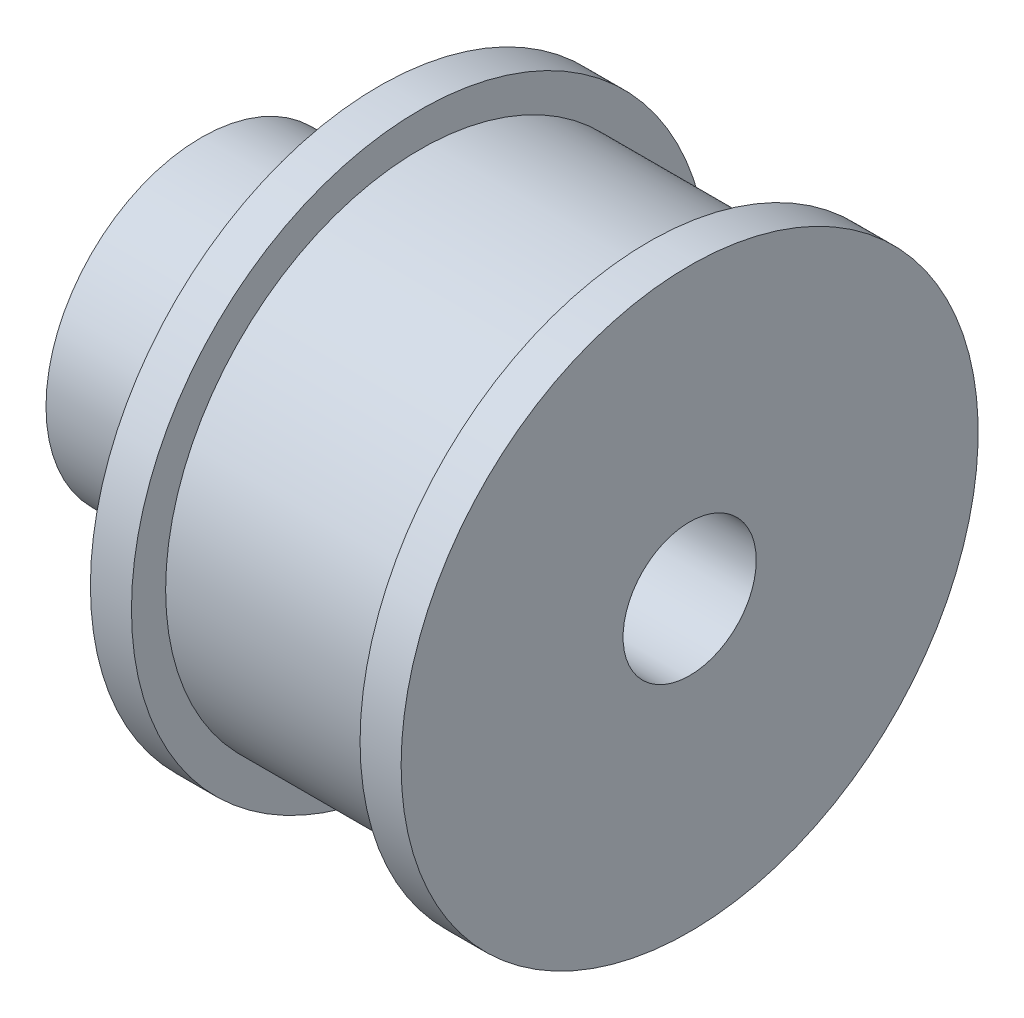
ISO-10303-21;
HEADER;
FILE_DESCRIPTION(('STEP AP214'),'2;1');
FILE_NAME('part.step','',(''),(''),'','','');
FILE_SCHEMA(('AUTOMOTIVE_DESIGN { 1 0 10303 214 1 1 1 1 }'));
ENDSEC;
DATA;
#1=APPLICATION_CONTEXT('core data for automotive mechanical design processes');
#2=APPLICATION_PROTOCOL_DEFINITION('international standard','automotive_design',2000,#1);
#3=PRODUCT_CONTEXT('',#1,'mechanical');
#4=PRODUCT('Part','Part','',(#3));
#5=PRODUCT_RELATED_PRODUCT_CATEGORY('part','',(#4));
#6=PRODUCT_DEFINITION_FORMATION('','',#4);
#7=PRODUCT_DEFINITION_CONTEXT('part definition',#1,'design');
#8=PRODUCT_DEFINITION('design','',#6,#7);
#9=PRODUCT_DEFINITION_SHAPE('','',#8);
#10=(LENGTH_UNIT() NAMED_UNIT(*) SI_UNIT(.MILLI.,.METRE.));
#11=(NAMED_UNIT(*) PLANE_ANGLE_UNIT() SI_UNIT($,.RADIAN.));
#12=(NAMED_UNIT(*) SI_UNIT($,.STERADIAN.) SOLID_ANGLE_UNIT());
#13=UNCERTAINTY_MEASURE_WITH_UNIT(LENGTH_MEASURE(1.E-05),#10,'distance_accuracy_value','');
#14=(GEOMETRIC_REPRESENTATION_CONTEXT(3) GLOBAL_UNCERTAINTY_ASSIGNED_CONTEXT((#13)) GLOBAL_UNIT_ASSIGNED_CONTEXT((#10,
#11,#12)) REPRESENTATION_CONTEXT('',''));
#15=CARTESIAN_POINT('',(0.,0.,0.));
#16=DIRECTION('',(0.,0.,1.));
#17=DIRECTION('',(1.,0.,0.));
#18=AXIS2_PLACEMENT_3D('',#15,#16,#17);
#19=CARTESIAN_POINT('',(-5.15,0.,11.46));
#20=DIRECTION('',(1.,0.,0.));
#21=DIRECTION('',(0.,0.,-1.));
#22=AXIS2_PLACEMENT_3D('',#19,#20,#21);
#23=PLANE('',#22);
#24=CARTESIAN_POINT('',(-5.15,0.,0.));
#25=DIRECTION('',(-1.,0.,0.));
#26=DIRECTION('',(0.,0.,1.));
#27=AXIS2_PLACEMENT_3D('',#24,#25,#26);
#28=CIRCLE('',#27,11.46);
#29=CARTESIAN_POINT('',(-5.15,0.,11.46));
#30=VERTEX_POINT('',#29);
#31=EDGE_CURVE('E58',#30,#30,#28,.T.);
#32=ORIENTED_EDGE('',*,*,#31,.T.);
#33=EDGE_LOOP('',(#32));
#34=FACE_BOUND('',#33,.T.);
#35=CARTESIAN_POINT('',(-5.15,0.,0.));
#36=DIRECTION('',(-1.,0.,0.));
#37=DIRECTION('',(0.,0.,1.));
#38=AXIS2_PLACEMENT_3D('',#35,#36,#37);
#39=CIRCLE('',#38,13.);
#40=CARTESIAN_POINT('',(-5.15,0.,13.));
#41=VERTEX_POINT('',#40);
#42=EDGE_CURVE('E10',#41,#41,#39,.T.);
#43=ORIENTED_EDGE('',*,*,#42,.F.);
#44=EDGE_LOOP('',(#43));
#45=FACE_BOUND('',#44,.T.);
#46=ADVANCED_FACE('F30',(#34,#45),#23,.T.);
#47=CARTESIAN_POINT('',(-7.,0.,0.));
#48=DIRECTION('',(-1.,0.,0.));
#49=DIRECTION('',(0.,0.,1.));
#50=AXIS2_PLACEMENT_3D('',#47,#48,#49);
#51=CYLINDRICAL_SURFACE('',#50,13.);
#52=ORIENTED_EDGE('',*,*,#42,.T.);
#53=EDGE_LOOP('',(#52));
#54=FACE_BOUND('',#53,.T.);
#55=CARTESIAN_POINT('',(-7.,0.,0.));
#56=DIRECTION('',(-1.,0.,0.));
#57=DIRECTION('',(0.,0.,1.));
#58=AXIS2_PLACEMENT_3D('',#55,#56,#57);
#59=CIRCLE('',#58,13.);
#60=CARTESIAN_POINT('',(-7.,0.,13.));
#61=VERTEX_POINT('',#60);
#62=EDGE_CURVE('E36',#61,#61,#59,.T.);
#63=ORIENTED_EDGE('',*,*,#62,.F.);
#64=EDGE_LOOP('',(#63));
#65=FACE_BOUND('',#64,.T.);
#66=ADVANCED_FACE('F97',(#54,#65),#51,.T.);
#67=CARTESIAN_POINT('',(-7.,0.,13.));
#68=DIRECTION('',(-1.,0.,0.));
#69=DIRECTION('',(0.,0.,1.));
#70=AXIS2_PLACEMENT_3D('',#67,#68,#69);
#71=PLANE('',#70);
#72=ORIENTED_EDGE('',*,*,#62,.T.);
#73=EDGE_LOOP('',(#72));
#74=FACE_BOUND('',#73,.T.);
#75=CARTESIAN_POINT('',(-7.,0.,0.));
#76=DIRECTION('',(-1.,0.,0.));
#77=DIRECTION('',(0.,0.,1.));
#78=AXIS2_PLACEMENT_3D('',#75,#76,#77);
#79=CIRCLE('',#78,7.);
#80=CARTESIAN_POINT('',(-7.,0.,7.));
#81=VERTEX_POINT('',#80);
#82=EDGE_CURVE('E40',#81,#81,#79,.T.);
#83=ORIENTED_EDGE('',*,*,#82,.F.);
#84=EDGE_LOOP('',(#83));
#85=FACE_BOUND('',#84,.T.);
#86=ADVANCED_FACE('F101',(#74,#85),#71,.T.);
#87=CARTESIAN_POINT('',(-7.,0.,0.));
#88=DIRECTION('',(-1.,0.,0.));
#89=DIRECTION('',(0.,0.,1.));
#90=AXIS2_PLACEMENT_3D('',#87,#88,#89);
#91=CYLINDRICAL_SURFACE('',#90,7.);
#92=ORIENTED_EDGE('',*,*,#82,.T.);
#93=EDGE_LOOP('',(#92));
#94=FACE_BOUND('',#93,.T.);
#95=CARTESIAN_POINT('',(-15.,0.,0.));
#96=DIRECTION('',(-1.,0.,0.));
#97=DIRECTION('',(0.,0.,1.));
#98=AXIS2_PLACEMENT_3D('',#95,#96,#97);
#99=CIRCLE('',#98,7.);
#100=CARTESIAN_POINT('',(-15.,0.,7.));
#101=VERTEX_POINT('',#100);
#102=EDGE_CURVE('E44',#101,#101,#99,.T.);
#103=ORIENTED_EDGE('',*,*,#102,.F.);
#104=EDGE_LOOP('',(#103));
#105=FACE_BOUND('',#104,.T.);
#106=ADVANCED_FACE('F105',(#94,#105),#91,.T.);
#107=CARTESIAN_POINT('',(-15.,0.,0.));
#108=DIRECTION('',(-1.,0.,0.));
#109=DIRECTION('',(0.,0.,1.));
#110=AXIS2_PLACEMENT_3D('',#107,#108,#109);
#111=PLANE('',#110);
#112=CARTESIAN_POINT('',(-15.,0.,0.));
#113=DIRECTION('',(-1.,0.,0.));
#114=DIRECTION('',(0.,0.,1.));
#115=AXIS2_PLACEMENT_3D('',#112,#113,#114);
#116=CIRCLE('',#115,2.99999999999999);
#117=CARTESIAN_POINT('',(-15.,0.,2.99999999999999));
#118=VERTEX_POINT('',#117);
#119=EDGE_CURVE('E61',#118,#118,#116,.T.);
#120=ORIENTED_EDGE('',*,*,#119,.F.);
#121=EDGE_LOOP('',(#120));
#122=FACE_BOUND('',#121,.T.);
#123=ORIENTED_EDGE('',*,*,#102,.T.);
#124=EDGE_LOOP('',(#123));
#125=FACE_BOUND('',#124,.T.);
#126=ADVANCED_FACE('F74',(#122,#125),#111,.T.);
#127=CARTESIAN_POINT('',(7.,0.,0.));
#128=DIRECTION('',(1.,0.,0.));
#129=DIRECTION('',(0.,0.,-1.));
#130=AXIS2_PLACEMENT_3D('',#127,#128,#129);
#131=PLANE('',#130);
#132=CARTESIAN_POINT('',(7.,0.,0.));
#133=DIRECTION('',(1.,0.,0.));
#134=DIRECTION('',(0.,0.,-1.));
#135=AXIS2_PLACEMENT_3D('',#132,#133,#134);
#136=CIRCLE('',#135,2.99999999999999);
#137=CARTESIAN_POINT('',(7.,0.,-2.99999999999999));
#138=VERTEX_POINT('',#137);
#139=EDGE_CURVE('E64',#138,#138,#136,.T.);
#140=ORIENTED_EDGE('',*,*,#139,.F.);
#141=EDGE_LOOP('',(#140));
#142=FACE_BOUND('',#141,.T.);
#143=CARTESIAN_POINT('',(7.,0.,0.));
#144=DIRECTION('',(-1.,0.,0.));
#145=DIRECTION('',(0.,0.,1.));
#146=AXIS2_PLACEMENT_3D('',#143,#144,#145);
#147=CIRCLE('',#146,13.);
#148=CARTESIAN_POINT('',(7.,0.,13.));
#149=VERTEX_POINT('',#148);
#150=EDGE_CURVE('E49',#149,#149,#147,.T.);
#151=ORIENTED_EDGE('',*,*,#150,.F.);
#152=EDGE_LOOP('',(#151));
#153=FACE_BOUND('',#152,.T.);
#154=ADVANCED_FACE('F70',(#142,#153),#131,.T.);
#155=CARTESIAN_POINT('',(-7.,0.,0.));
#156=DIRECTION('',(-1.,0.,0.));
#157=DIRECTION('',(0.,0.,1.));
#158=AXIS2_PLACEMENT_3D('',#155,#156,#157);
#159=CYLINDRICAL_SURFACE('',#158,13.);
#160=ORIENTED_EDGE('',*,*,#150,.T.);
#161=EDGE_LOOP('',(#160));
#162=FACE_BOUND('',#161,.T.);
#163=CARTESIAN_POINT('',(5.15,0.,0.));
#164=DIRECTION('',(-1.,0.,0.));
#165=DIRECTION('',(0.,0.,1.));
#166=AXIS2_PLACEMENT_3D('',#163,#164,#165);
#167=CIRCLE('',#166,13.);
#168=CARTESIAN_POINT('',(5.15,0.,13.));
#169=VERTEX_POINT('',#168);
#170=EDGE_CURVE('E52',#169,#169,#167,.T.);
#171=ORIENTED_EDGE('',*,*,#170,.F.);
#172=EDGE_LOOP('',(#171));
#173=FACE_BOUND('',#172,.T.);
#174=ADVANCED_FACE('F73',(#162,#173),#159,.T.);
#175=CARTESIAN_POINT('',(5.15,0.,13.));
#176=DIRECTION('',(-1.,0.,0.));
#177=DIRECTION('',(0.,0.,1.));
#178=AXIS2_PLACEMENT_3D('',#175,#176,#177);
#179=PLANE('',#178);
#180=ORIENTED_EDGE('',*,*,#170,.T.);
#181=EDGE_LOOP('',(#180));
#182=FACE_BOUND('',#181,.T.);
#183=CARTESIAN_POINT('',(5.15,0.,0.));
#184=DIRECTION('',(-1.,0.,0.));
#185=DIRECTION('',(0.,0.,1.));
#186=AXIS2_PLACEMENT_3D('',#183,#184,#185);
#187=CIRCLE('',#186,11.46);
#188=CARTESIAN_POINT('',(5.15,0.,11.46));
#189=VERTEX_POINT('',#188);
#190=EDGE_CURVE('E55',#189,#189,#187,.T.);
#191=ORIENTED_EDGE('',*,*,#190,.F.);
#192=EDGE_LOOP('',(#191));
#193=FACE_BOUND('',#192,.T.);
#194=ADVANCED_FACE('F80',(#182,#193),#179,.T.);
#195=CARTESIAN_POINT('',(-7.,0.,0.));
#196=DIRECTION('',(-1.,0.,0.));
#197=DIRECTION('',(0.,0.,1.));
#198=AXIS2_PLACEMENT_3D('',#195,#196,#197);
#199=CYLINDRICAL_SURFACE('',#198,11.46);
#200=ORIENTED_EDGE('',*,*,#190,.T.);
#201=EDGE_LOOP('',(#200));
#202=FACE_BOUND('',#201,.T.);
#203=ORIENTED_EDGE('',*,*,#31,.F.);
#204=EDGE_LOOP('',(#203));
#205=FACE_BOUND('',#204,.T.);
#206=ADVANCED_FACE('F86',(#202,#205),#199,.T.);
#207=CARTESIAN_POINT('',(7.,0.,0.));
#208=DIRECTION('',(1.,0.,0.));
#209=DIRECTION('',(0.,0.,-1.));
#210=AXIS2_PLACEMENT_3D('',#207,#208,#209);
#211=CYLINDRICAL_SURFACE('',#210,2.99999999999999);
#212=ORIENTED_EDGE('',*,*,#119,.T.);
#213=EDGE_LOOP('',(#212));
#214=FACE_BOUND('',#213,.T.);
#215=ORIENTED_EDGE('',*,*,#139,.T.);
#216=EDGE_LOOP('',(#215));
#217=FACE_BOUND('',#216,.T.);
#218=ADVANCED_FACE('F68',(#214,#217),#211,.F.);
#219=CLOSED_SHELL('',(#46,#66,#86,#106,#126,#154,#174,#194,#206,#218));
#220=MANIFOLD_SOLID_BREP('B2',#219);
#221=ADVANCED_BREP_SHAPE_REPRESENTATION('',(#18,#220),#14);
#222=SHAPE_DEFINITION_REPRESENTATION(#9,#221);
ENDSEC;
END-ISO-10303-21;
